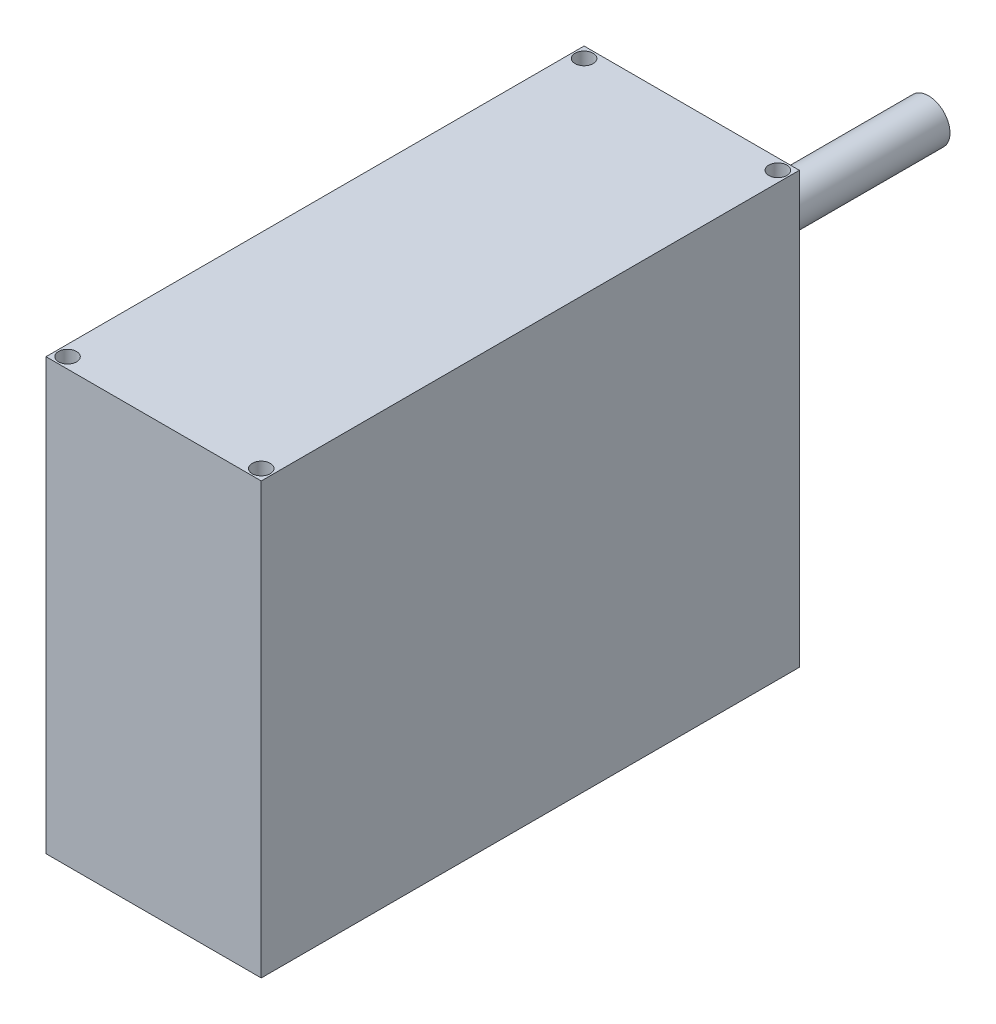
ISO-10303-21;
HEADER;
FILE_DESCRIPTION(('STEP AP214'),'2;1');
FILE_NAME('part.step','',(''),(''),'','','');
FILE_SCHEMA(('AUTOMOTIVE_DESIGN { 1 0 10303 214 1 1 1 1 }'));
ENDSEC;
DATA;
#1=APPLICATION_CONTEXT('core data for automotive mechanical design processes');
#2=APPLICATION_PROTOCOL_DEFINITION('international standard','automotive_design',2000,#1);
#3=PRODUCT_CONTEXT('',#1,'mechanical');
#4=PRODUCT('Part','Part','',(#3));
#5=PRODUCT_RELATED_PRODUCT_CATEGORY('part','',(#4));
#6=PRODUCT_DEFINITION_FORMATION('','',#4);
#7=PRODUCT_DEFINITION_CONTEXT('part definition',#1,'design');
#8=PRODUCT_DEFINITION('design','',#6,#7);
#9=PRODUCT_DEFINITION_SHAPE('','',#8);
#10=(LENGTH_UNIT() NAMED_UNIT(*) SI_UNIT(.MILLI.,.METRE.));
#11=(NAMED_UNIT(*) PLANE_ANGLE_UNIT() SI_UNIT($,.RADIAN.));
#12=(NAMED_UNIT(*) SI_UNIT($,.STERADIAN.) SOLID_ANGLE_UNIT());
#13=UNCERTAINTY_MEASURE_WITH_UNIT(LENGTH_MEASURE(1.E-05),#10,'distance_accuracy_value','');
#14=(GEOMETRIC_REPRESENTATION_CONTEXT(3) GLOBAL_UNCERTAINTY_ASSIGNED_CONTEXT((#13)) GLOBAL_UNIT_ASSIGNED_CONTEXT((#10,
#11,#12)) REPRESENTATION_CONTEXT('',''));
#15=CARTESIAN_POINT('',(0.,0.,0.));
#16=DIRECTION('',(0.,0.,1.));
#17=DIRECTION('',(1.,0.,0.));
#18=AXIS2_PLACEMENT_3D('',#15,#16,#17);
#19=CARTESIAN_POINT('',(25.,-50.,125.));
#20=DIRECTION('',(-1.,0.,0.));
#21=DIRECTION('',(0.,0.,1.));
#22=AXIS2_PLACEMENT_3D('',#19,#20,#21);
#23=PLANE('',#22);
#24=DIRECTION('',(0.,1.,0.));
#25=VECTOR('',#24,1.);
#26=CARTESIAN_POINT('',(25.,-50.,0.));
#27=LINE('',#26,#25);
#28=CARTESIAN_POINT('',(25.,-50.,0.));
#29=VERTEX_POINT('',#28);
#30=CARTESIAN_POINT('',(25.,50.,0.));
#31=VERTEX_POINT('',#30);
#32=EDGE_CURVE('E98',#29,#31,#27,.T.);
#33=ORIENTED_EDGE('',*,*,#32,.T.);
#34=DIRECTION('',(0.,0.,-1.));
#35=VECTOR('',#34,1.);
#36=CARTESIAN_POINT('',(25.,50.,125.));
#37=LINE('',#36,#35);
#38=CARTESIAN_POINT('',(25.,50.,125.));
#39=VERTEX_POINT('',#38);
#40=EDGE_CURVE('E40',#39,#31,#37,.T.);
#41=ORIENTED_EDGE('',*,*,#40,.F.);
#42=DIRECTION('',(0.,1.,0.));
#43=VECTOR('',#42,1.);
#44=CARTESIAN_POINT('',(25.,-50.,125.));
#45=LINE('',#44,#43);
#46=CARTESIAN_POINT('',(25.,-50.,125.));
#47=VERTEX_POINT('',#46);
#48=EDGE_CURVE('E84',#47,#39,#45,.T.);
#49=ORIENTED_EDGE('',*,*,#48,.F.);
#50=DIRECTION('',(0.,0.,-1.));
#51=VECTOR('',#50,1.);
#52=CARTESIAN_POINT('',(25.,-50.,125.));
#53=LINE('',#52,#51);
#54=EDGE_CURVE('E94',#47,#29,#53,.T.);
#55=ORIENTED_EDGE('',*,*,#54,.T.);
#56=EDGE_LOOP('',(#33,#41,#49,#55));
#57=FACE_BOUND('',#56,.T.);
#58=ADVANCED_FACE('F32',(#57),#23,.F.);
#59=CARTESIAN_POINT('',(-25.,50.,125.));
#60=DIRECTION('',(0.,-1.,0.));
#61=DIRECTION('',(0.,0.,-1.));
#62=AXIS2_PLACEMENT_3D('',#59,#60,#61);
#63=PLANE('',#62);
#64=CARTESIAN_POINT('',(-22.4999999999987,50.,122.5));
#65=DIRECTION('',(0.,1.,0.));
#66=DIRECTION('',(0.,0.,1.));
#67=AXIS2_PLACEMENT_3D('',#64,#65,#66);
#68=CIRCLE('',#67,2.1);
#69=CARTESIAN_POINT('',(-22.4999999999987,50.,124.6));
#70=VERTEX_POINT('',#69);
#71=EDGE_CURVE('E277',#70,#70,#68,.T.);
#72=ORIENTED_EDGE('',*,*,#71,.F.);
#73=EDGE_LOOP('',(#72));
#74=FACE_BOUND('',#73,.T.);
#75=CARTESIAN_POINT('',(22.5000000000012,50.,122.5));
#76=DIRECTION('',(0.,1.,0.));
#77=DIRECTION('',(0.,0.,1.));
#78=AXIS2_PLACEMENT_3D('',#75,#76,#77);
#79=CIRCLE('',#78,2.1);
#80=CARTESIAN_POINT('',(22.5000000000012,50.,124.6));
#81=VERTEX_POINT('',#80);
#82=EDGE_CURVE('E287',#81,#81,#79,.T.);
#83=ORIENTED_EDGE('',*,*,#82,.F.);
#84=EDGE_LOOP('',(#83));
#85=FACE_BOUND('',#84,.T.);
#86=CARTESIAN_POINT('',(22.5,50.,2.5));
#87=DIRECTION('',(0.,1.,0.));
#88=DIRECTION('',(0.,0.,1.));
#89=AXIS2_PLACEMENT_3D('',#86,#87,#88);
#90=CIRCLE('',#89,2.1);
#91=CARTESIAN_POINT('',(22.5,50.,4.6));
#92=VERTEX_POINT('',#91);
#93=EDGE_CURVE('E292',#92,#92,#90,.T.);
#94=ORIENTED_EDGE('',*,*,#93,.F.);
#95=EDGE_LOOP('',(#94));
#96=FACE_BOUND('',#95,.T.);
#97=CARTESIAN_POINT('',(-22.5,50.,2.5));
#98=DIRECTION('',(0.,1.,0.));
#99=DIRECTION('',(0.,0.,1.));
#100=AXIS2_PLACEMENT_3D('',#97,#98,#99);
#101=CIRCLE('',#100,2.1);
#102=CARTESIAN_POINT('',(-22.5,50.,4.6));
#103=VERTEX_POINT('',#102);
#104=EDGE_CURVE('E298',#103,#103,#101,.T.);
#105=ORIENTED_EDGE('',*,*,#104,.F.);
#106=EDGE_LOOP('',(#105));
#107=FACE_BOUND('',#106,.T.);
#108=DIRECTION('',(-1.,0.,0.));
#109=VECTOR('',#108,1.);
#110=CARTESIAN_POINT('',(-25.,50.,0.));
#111=LINE('',#110,#109);
#112=CARTESIAN_POINT('',(-25.,50.,0.));
#113=VERTEX_POINT('',#112);
#114=EDGE_CURVE('E89',#31,#113,#111,.T.);
#115=ORIENTED_EDGE('',*,*,#114,.T.);
#116=DIRECTION('',(0.,0.,-1.));
#117=VECTOR('',#116,1.);
#118=CARTESIAN_POINT('',(-25.,50.,125.));
#119=LINE('',#118,#117);
#120=CARTESIAN_POINT('',(-25.,50.,125.));
#121=VERTEX_POINT('',#120);
#122=EDGE_CURVE('E87',#121,#113,#119,.T.);
#123=ORIENTED_EDGE('',*,*,#122,.F.);
#124=DIRECTION('',(-1.,0.,0.));
#125=VECTOR('',#124,1.);
#126=CARTESIAN_POINT('',(-25.,50.,125.));
#127=LINE('',#126,#125);
#128=EDGE_CURVE('E79',#39,#121,#127,.T.);
#129=ORIENTED_EDGE('',*,*,#128,.F.);
#130=ORIENTED_EDGE('',*,*,#40,.T.);
#131=EDGE_LOOP('',(#115,#123,#129,#130));
#132=FACE_BOUND('',#131,.T.);
#133=ADVANCED_FACE('F88',(#74,#85,#96,#107,#132),#63,.F.);
#134=CARTESIAN_POINT('',(-25.,-50.,125.));
#135=DIRECTION('',(1.,0.,0.));
#136=DIRECTION('',(0.,0.,-1.));
#137=AXIS2_PLACEMENT_3D('',#134,#135,#136);
#138=PLANE('',#137);
#139=DIRECTION('',(0.,-1.,0.));
#140=VECTOR('',#139,1.);
#141=CARTESIAN_POINT('',(-25.,-50.,0.));
#142=LINE('',#141,#140);
#143=CARTESIAN_POINT('',(-25.,-50.,0.));
#144=VERTEX_POINT('',#143);
#145=EDGE_CURVE('E65',#113,#144,#142,.T.);
#146=ORIENTED_EDGE('',*,*,#145,.T.);
#147=DIRECTION('',(0.,0.,-1.));
#148=VECTOR('',#147,1.);
#149=CARTESIAN_POINT('',(-25.,-50.,125.));
#150=LINE('',#149,#148);
#151=CARTESIAN_POINT('',(-25.,-50.,125.));
#152=VERTEX_POINT('',#151);
#153=EDGE_CURVE('E90',#152,#144,#150,.T.);
#154=ORIENTED_EDGE('',*,*,#153,.F.);
#155=DIRECTION('',(0.,-1.,0.));
#156=VECTOR('',#155,1.);
#157=CARTESIAN_POINT('',(-25.,-50.,125.));
#158=LINE('',#157,#156);
#159=EDGE_CURVE('E82',#121,#152,#158,.T.);
#160=ORIENTED_EDGE('',*,*,#159,.F.);
#161=ORIENTED_EDGE('',*,*,#122,.T.);
#162=EDGE_LOOP('',(#146,#154,#160,#161));
#163=FACE_BOUND('',#162,.T.);
#164=ADVANCED_FACE('F92',(#163),#138,.F.);
#165=CARTESIAN_POINT('',(-25.,-50.,125.));
#166=DIRECTION('',(0.,1.,0.));
#167=DIRECTION('',(0.,0.,1.));
#168=AXIS2_PLACEMENT_3D('',#165,#166,#167);
#169=PLANE('',#168);
#170=DIRECTION('',(1.,0.,0.));
#171=VECTOR('',#170,1.);
#172=CARTESIAN_POINT('',(-25.,-50.,0.));
#173=LINE('',#172,#171);
#174=EDGE_CURVE('E71',#144,#29,#173,.T.);
#175=ORIENTED_EDGE('',*,*,#174,.T.);
#176=ORIENTED_EDGE('',*,*,#54,.F.);
#177=DIRECTION('',(1.,0.,0.));
#178=VECTOR('',#177,1.);
#179=CARTESIAN_POINT('',(-25.,-50.,125.));
#180=LINE('',#179,#178);
#181=EDGE_CURVE('E48',#152,#47,#180,.T.);
#182=ORIENTED_EDGE('',*,*,#181,.F.);
#183=ORIENTED_EDGE('',*,*,#153,.T.);
#184=EDGE_LOOP('',(#175,#176,#182,#183));
#185=FACE_BOUND('',#184,.T.);
#186=ADVANCED_FACE('F121',(#185),#169,.F.);
#187=CARTESIAN_POINT('',(0.,0.,125.));
#188=DIRECTION('',(0.,0.,-1.));
#189=DIRECTION('',(-1.,0.,0.));
#190=AXIS2_PLACEMENT_3D('',#187,#188,#189);
#191=PLANE('',#190);
#192=ORIENTED_EDGE('',*,*,#48,.T.);
#193=ORIENTED_EDGE('',*,*,#128,.T.);
#194=ORIENTED_EDGE('',*,*,#159,.T.);
#195=ORIENTED_EDGE('',*,*,#181,.T.);
#196=EDGE_LOOP('',(#192,#193,#194,#195));
#197=FACE_BOUND('',#196,.T.);
#198=ADVANCED_FACE('F80',(#197),#191,.F.);
#199=CARTESIAN_POINT('',(0.,0.,0.));
#200=DIRECTION('',(0.,0.,-1.));
#201=DIRECTION('',(-1.,0.,0.));
#202=AXIS2_PLACEMENT_3D('',#199,#200,#201);
#203=PLANE('',#202);
#204=CARTESIAN_POINT('',(0.,20.,0.));
#205=DIRECTION('',(0.,0.,-1.));
#206=DIRECTION('',(-1.,0.,0.));
#207=AXIS2_PLACEMENT_3D('',#204,#205,#206);
#208=CIRCLE('',#207,5.);
#209=CARTESIAN_POINT('',(-5.,20.,0.));
#210=VERTEX_POINT('',#209);
#211=EDGE_CURVE('E11',#210,#210,#208,.T.);
#212=ORIENTED_EDGE('',*,*,#211,.F.);
#213=EDGE_LOOP('',(#212));
#214=FACE_BOUND('',#213,.T.);
#215=ORIENTED_EDGE('',*,*,#32,.F.);
#216=ORIENTED_EDGE('',*,*,#174,.F.);
#217=ORIENTED_EDGE('',*,*,#145,.F.);
#218=ORIENTED_EDGE('',*,*,#114,.F.);
#219=EDGE_LOOP('',(#215,#216,#217,#218));
#220=FACE_BOUND('',#219,.T.);
#221=ADVANCED_FACE('F109',(#214,#220),#203,.T.);
#222=CARTESIAN_POINT('',(0.,20.,-55.));
#223=DIRECTION('',(0.,0.,1.));
#224=DIRECTION('',(1.,0.,0.));
#225=AXIS2_PLACEMENT_3D('',#222,#223,#224);
#226=CYLINDRICAL_SURFACE('',#225,5.);
#227=CARTESIAN_POINT('',(0.,20.,-55.));
#228=DIRECTION('',(0.,0.,1.));
#229=DIRECTION('',(1.,0.,0.));
#230=AXIS2_PLACEMENT_3D('',#227,#228,#229);
#231=CIRCLE('',#230,5.);
#232=CARTESIAN_POINT('',(5.,20.,-55.));
#233=VERTEX_POINT('',#232);
#234=EDGE_CURVE('E101',#233,#233,#231,.T.);
#235=ORIENTED_EDGE('',*,*,#234,.T.);
#236=EDGE_LOOP('',(#235));
#237=FACE_BOUND('',#236,.T.);
#238=ORIENTED_EDGE('',*,*,#211,.T.);
#239=EDGE_LOOP('',(#238));
#240=FACE_BOUND('',#239,.T.);
#241=ADVANCED_FACE('F111',(#237,#240),#226,.T.);
#242=CARTESIAN_POINT('',(0.,20.,-55.));
#243=DIRECTION('',(0.,0.,1.));
#244=DIRECTION('',(1.,0.,0.));
#245=AXIS2_PLACEMENT_3D('',#242,#243,#244);
#246=PLANE('',#245);
#247=CARTESIAN_POINT('',(0.,20.,-55.));
#248=DIRECTION('',(0.,0.,-1.));
#249=DIRECTION('',(-1.,0.,0.));
#250=AXIS2_PLACEMENT_3D('',#247,#248,#249);
#251=CIRCLE('',#250,3.2);
#252=CARTESIAN_POINT('',(-3.2,20.,-55.));
#253=VERTEX_POINT('',#252);
#254=EDGE_CURVE('E278',#253,#253,#251,.T.);
#255=ORIENTED_EDGE('',*,*,#254,.F.);
#256=EDGE_LOOP('',(#255));
#257=FACE_BOUND('',#256,.T.);
#258=ORIENTED_EDGE('',*,*,#234,.F.);
#259=EDGE_LOOP('',(#258));
#260=FACE_BOUND('',#259,.T.);
#261=ADVANCED_FACE('F118',(#257,#260),#246,.F.);
#262=CARTESIAN_POINT('',(-22.5,44.,2.5));
#263=DIRECTION('',(0.,1.,0.));
#264=DIRECTION('',(0.,0.,1.));
#265=AXIS2_PLACEMENT_3D('',#262,#263,#264);
#266=CYLINDRICAL_SURFACE('',#265,2.1);
#267=CARTESIAN_POINT('',(-22.5,44.,2.5));
#268=DIRECTION('',(0.,1.,0.));
#269=DIRECTION('',(0.,0.,1.));
#270=AXIS2_PLACEMENT_3D('',#267,#268,#269);
#271=CIRCLE('',#270,2.1);
#272=CARTESIAN_POINT('',(-22.5,44.,4.6));
#273=VERTEX_POINT('',#272);
#274=EDGE_CURVE('E301',#273,#273,#271,.T.);
#275=ORIENTED_EDGE('',*,*,#274,.F.);
#276=EDGE_LOOP('',(#275));
#277=FACE_BOUND('',#276,.T.);
#278=ORIENTED_EDGE('',*,*,#104,.T.);
#279=EDGE_LOOP('',(#278));
#280=FACE_BOUND('',#279,.T.);
#281=ADVANCED_FACE('F168',(#277,#280),#266,.F.);
#282=CARTESIAN_POINT('',(-22.5,44.,2.5));
#283=DIRECTION('',(0.,1.,0.));
#284=DIRECTION('',(0.,0.,1.));
#285=AXIS2_PLACEMENT_3D('',#282,#283,#284);
#286=PLANE('',#285);
#287=ORIENTED_EDGE('',*,*,#274,.T.);
#288=EDGE_LOOP('',(#287));
#289=FACE_BOUND('',#288,.T.);
#290=ADVANCED_FACE('F173',(#289),#286,.T.);
#291=CARTESIAN_POINT('',(22.5,44.,2.5));
#292=DIRECTION('',(0.,1.,0.));
#293=DIRECTION('',(0.,0.,1.));
#294=AXIS2_PLACEMENT_3D('',#291,#292,#293);
#295=CYLINDRICAL_SURFACE('',#294,2.1);
#296=CARTESIAN_POINT('',(22.5,44.,2.5));
#297=DIRECTION('',(0.,1.,0.));
#298=DIRECTION('',(0.,0.,1.));
#299=AXIS2_PLACEMENT_3D('',#296,#297,#298);
#300=CIRCLE('',#299,2.1);
#301=CARTESIAN_POINT('',(22.5,44.,4.6));
#302=VERTEX_POINT('',#301);
#303=EDGE_CURVE('E295',#302,#302,#300,.T.);
#304=ORIENTED_EDGE('',*,*,#303,.F.);
#305=EDGE_LOOP('',(#304));
#306=FACE_BOUND('',#305,.T.);
#307=ORIENTED_EDGE('',*,*,#93,.T.);
#308=EDGE_LOOP('',(#307));
#309=FACE_BOUND('',#308,.T.);
#310=ADVANCED_FACE('F183',(#306,#309),#295,.F.);
#311=CARTESIAN_POINT('',(22.5,44.,2.5));
#312=DIRECTION('',(0.,1.,0.));
#313=DIRECTION('',(0.,0.,1.));
#314=AXIS2_PLACEMENT_3D('',#311,#312,#313);
#315=PLANE('',#314);
#316=ORIENTED_EDGE('',*,*,#303,.T.);
#317=EDGE_LOOP('',(#316));
#318=FACE_BOUND('',#317,.T.);
#319=ADVANCED_FACE('F193',(#318),#315,.T.);
#320=CARTESIAN_POINT('',(22.5000000000012,44.,122.5));
#321=DIRECTION('',(0.,1.,0.));
#322=DIRECTION('',(0.,0.,1.));
#323=AXIS2_PLACEMENT_3D('',#320,#321,#322);
#324=CYLINDRICAL_SURFACE('',#323,2.1);
#325=CARTESIAN_POINT('',(22.5000000000012,44.,122.5));
#326=DIRECTION('',(0.,1.,0.));
#327=DIRECTION('',(0.,0.,1.));
#328=AXIS2_PLACEMENT_3D('',#325,#326,#327);
#329=CIRCLE('',#328,2.1);
#330=CARTESIAN_POINT('',(22.5000000000012,44.,124.6));
#331=VERTEX_POINT('',#330);
#332=EDGE_CURVE('E289',#331,#331,#329,.T.);
#333=ORIENTED_EDGE('',*,*,#332,.F.);
#334=EDGE_LOOP('',(#333));
#335=FACE_BOUND('',#334,.T.);
#336=ORIENTED_EDGE('',*,*,#82,.T.);
#337=EDGE_LOOP('',(#336));
#338=FACE_BOUND('',#337,.T.);
#339=ADVANCED_FACE('F203',(#335,#338),#324,.F.);
#340=CARTESIAN_POINT('',(22.5000000000012,44.,122.5));
#341=DIRECTION('',(0.,1.,0.));
#342=DIRECTION('',(0.,0.,1.));
#343=AXIS2_PLACEMENT_3D('',#340,#341,#342);
#344=PLANE('',#343);
#345=ORIENTED_EDGE('',*,*,#332,.T.);
#346=EDGE_LOOP('',(#345));
#347=FACE_BOUND('',#346,.T.);
#348=ADVANCED_FACE('F213',(#347),#344,.T.);
#349=CARTESIAN_POINT('',(-22.4999999999987,44.,122.5));
#350=DIRECTION('',(0.,1.,0.));
#351=DIRECTION('',(0.,0.,1.));
#352=AXIS2_PLACEMENT_3D('',#349,#350,#351);
#353=CYLINDRICAL_SURFACE('',#352,2.1);
#354=CARTESIAN_POINT('',(-22.4999999999987,44.,122.5));
#355=DIRECTION('',(0.,1.,0.));
#356=DIRECTION('',(0.,0.,1.));
#357=AXIS2_PLACEMENT_3D('',#354,#355,#356);
#358=CIRCLE('',#357,2.1);
#359=CARTESIAN_POINT('',(-22.4999999999987,44.,124.6));
#360=VERTEX_POINT('',#359);
#361=EDGE_CURVE('E281',#360,#360,#358,.T.);
#362=ORIENTED_EDGE('',*,*,#361,.F.);
#363=EDGE_LOOP('',(#362));
#364=FACE_BOUND('',#363,.T.);
#365=ORIENTED_EDGE('',*,*,#71,.T.);
#366=EDGE_LOOP('',(#365));
#367=FACE_BOUND('',#366,.T.);
#368=ADVANCED_FACE('F223',(#364,#367),#353,.F.);
#369=CARTESIAN_POINT('',(-22.4999999999987,44.,122.5));
#370=DIRECTION('',(0.,1.,0.));
#371=DIRECTION('',(0.,0.,1.));
#372=AXIS2_PLACEMENT_3D('',#369,#370,#371);
#373=PLANE('',#372);
#374=ORIENTED_EDGE('',*,*,#361,.T.);
#375=EDGE_LOOP('',(#374));
#376=FACE_BOUND('',#375,.T.);
#377=ADVANCED_FACE('F233',(#376),#373,.T.);
#378=CARTESIAN_POINT('',(0.,20.,-45.));
#379=DIRECTION('',(0.,0.,-1.));
#380=DIRECTION('',(-1.,0.,0.));
#381=AXIS2_PLACEMENT_3D('',#378,#379,#380);
#382=CYLINDRICAL_SURFACE('',#381,3.2);
#383=CARTESIAN_POINT('',(0.,20.,-45.));
#384=DIRECTION('',(0.,0.,-1.));
#385=DIRECTION('',(-1.,0.,0.));
#386=AXIS2_PLACEMENT_3D('',#383,#384,#385);
#387=CIRCLE('',#386,3.2);
#388=CARTESIAN_POINT('',(-3.2,20.,-45.));
#389=VERTEX_POINT('',#388);
#390=EDGE_CURVE('E276',#389,#389,#387,.T.);
#391=ORIENTED_EDGE('',*,*,#390,.F.);
#392=EDGE_LOOP('',(#391));
#393=FACE_BOUND('',#392,.T.);
#394=ORIENTED_EDGE('',*,*,#254,.T.);
#395=EDGE_LOOP('',(#394));
#396=FACE_BOUND('',#395,.T.);
#397=ADVANCED_FACE('F243',(#393,#396),#382,.F.);
#398=CARTESIAN_POINT('',(0.,20.,-45.));
#399=DIRECTION('',(0.,0.,-1.));
#400=DIRECTION('',(-1.,0.,0.));
#401=AXIS2_PLACEMENT_3D('',#398,#399,#400);
#402=PLANE('',#401);
#403=ORIENTED_EDGE('',*,*,#390,.T.);
#404=EDGE_LOOP('',(#403));
#405=FACE_BOUND('',#404,.T.);
#406=ADVANCED_FACE('F260',(#405),#402,.T.);
#407=CLOSED_SHELL('',(#58,#133,#164,#186,#198,#221,#241,#261,#281,#290,#310,#319,#339,#348,#368,
#377,#397,#406));
#408=MANIFOLD_SOLID_BREP('B2',#407);
#409=ADVANCED_BREP_SHAPE_REPRESENTATION('',(#18,#408),#14);
#410=SHAPE_DEFINITION_REPRESENTATION(#9,#409);
ENDSEC;
END-ISO-10303-21;
